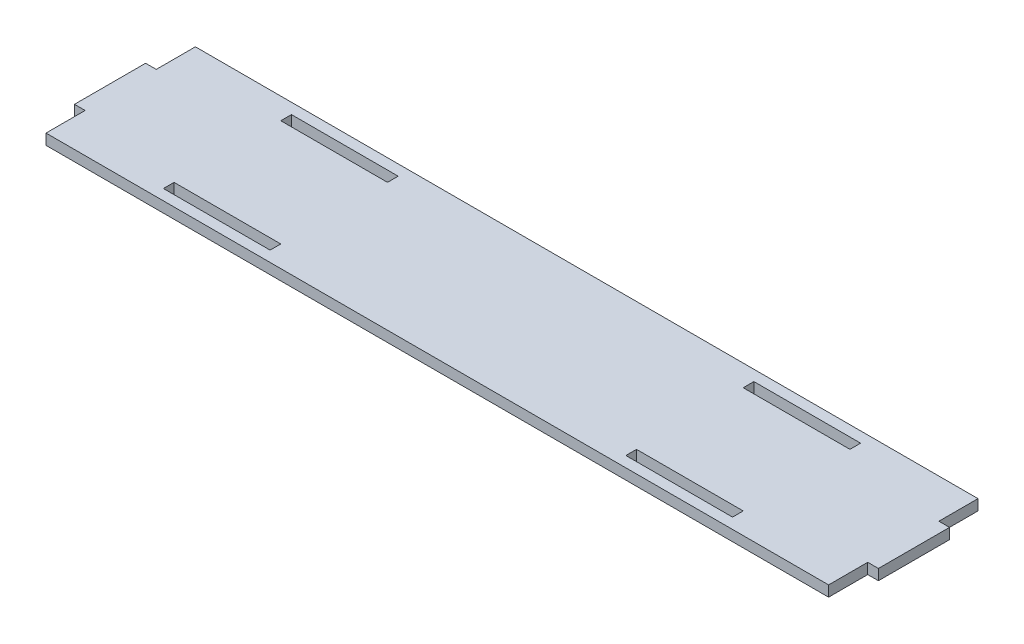
ISO-10303-21;
HEADER;
FILE_DESCRIPTION(('STEP AP214'),'2;1');
FILE_NAME('part.step','',(''),(''),'','','');
FILE_SCHEMA(('AUTOMOTIVE_DESIGN { 1 0 10303 214 1 1 1 1 }'));
ENDSEC;
DATA;
#1=APPLICATION_CONTEXT('core data for automotive mechanical design processes');
#2=APPLICATION_PROTOCOL_DEFINITION('international standard','automotive_design',2000,#1);
#3=PRODUCT_CONTEXT('',#1,'mechanical');
#4=PRODUCT('Part','Part','',(#3));
#5=PRODUCT_RELATED_PRODUCT_CATEGORY('part','',(#4));
#6=PRODUCT_DEFINITION_FORMATION('','',#4);
#7=PRODUCT_DEFINITION_CONTEXT('part definition',#1,'design');
#8=PRODUCT_DEFINITION('design','',#6,#7);
#9=PRODUCT_DEFINITION_SHAPE('','',#8);
#10=(LENGTH_UNIT() NAMED_UNIT(*) SI_UNIT(.MILLI.,.METRE.));
#11=(NAMED_UNIT(*) PLANE_ANGLE_UNIT() SI_UNIT($,.RADIAN.));
#12=(NAMED_UNIT(*) SI_UNIT($,.STERADIAN.) SOLID_ANGLE_UNIT());
#13=UNCERTAINTY_MEASURE_WITH_UNIT(LENGTH_MEASURE(1.E-05),#10,'distance_accuracy_value','');
#14=(GEOMETRIC_REPRESENTATION_CONTEXT(3) GLOBAL_UNCERTAINTY_ASSIGNED_CONTEXT((#13)) GLOBAL_UNIT_ASSIGNED_CONTEXT((#10,
#11,#12)) REPRESENTATION_CONTEXT('',''));
#15=CARTESIAN_POINT('',(0.,0.,0.));
#16=DIRECTION('',(0.,0.,1.));
#17=DIRECTION('',(1.,0.,0.));
#18=AXIS2_PLACEMENT_3D('',#15,#16,#17);
#19=CARTESIAN_POINT('',(0.,3.,0.));
#20=DIRECTION('',(0.,-1.,0.));
#21=DIRECTION('',(0.,0.,-1.));
#22=AXIS2_PLACEMENT_3D('',#19,#20,#21);
#23=PLANE('',#22);
#24=DIRECTION('',(1.,0.,0.));
#25=VECTOR('',#24,1.);
#26=CARTESIAN_POINT('',(30.,3.,-2.99999999999999));
#27=LINE('',#26,#25);
#28=CARTESIAN_POINT('',(30.,3.,-2.99999999999999));
#29=VERTEX_POINT('',#28);
#30=CARTESIAN_POINT('',(60.,3.,-2.99999999999999));
#31=VERTEX_POINT('',#30);
#32=EDGE_CURVE('E415',#29,#31,#27,.T.);
#33=ORIENTED_EDGE('',*,*,#32,.F.);
#34=DIRECTION('',(0.,0.,-1.));
#35=VECTOR('',#34,1.);
#36=CARTESIAN_POINT('',(30.,3.,-2.99999999999999));
#37=LINE('',#36,#35);
#38=CARTESIAN_POINT('',(30.,3.,-5.99999999999999));
#39=VERTEX_POINT('',#38);
#40=EDGE_CURVE('E412',#29,#39,#37,.T.);
#41=ORIENTED_EDGE('',*,*,#40,.T.);
#42=DIRECTION('',(1.,0.,0.));
#43=VECTOR('',#42,1.);
#44=CARTESIAN_POINT('',(30.,3.,-5.99999999999999));
#45=LINE('',#44,#43);
#46=CARTESIAN_POINT('',(60.,3.,-5.99999999999999));
#47=VERTEX_POINT('',#46);
#48=EDGE_CURVE('E418',#39,#47,#45,.T.);
#49=ORIENTED_EDGE('',*,*,#48,.T.);
#50=DIRECTION('',(0.,0.,-1.));
#51=VECTOR('',#50,1.);
#52=CARTESIAN_POINT('',(60.,3.,-2.99999999999999));
#53=LINE('',#52,#51);
#54=EDGE_CURVE('E422',#31,#47,#53,.T.);
#55=ORIENTED_EDGE('',*,*,#54,.F.);
#56=EDGE_LOOP('',(#33,#41,#49,#55));
#57=FACE_BOUND('',#56,.T.);
#58=DIRECTION('',(0.,0.,1.));
#59=VECTOR('',#58,1.);
#60=CARTESIAN_POINT('',(160.,3.,-39.));
#61=LINE('',#60,#59);
#62=CARTESIAN_POINT('',(160.,3.,-39.));
#63=VERTEX_POINT('',#62);
#64=CARTESIAN_POINT('',(160.,3.,-36.));
#65=VERTEX_POINT('',#64);
#66=EDGE_CURVE('E476',#63,#65,#61,.T.);
#67=ORIENTED_EDGE('',*,*,#66,.F.);
#68=DIRECTION('',(1.,0.,0.));
#69=VECTOR('',#68,1.);
#70=CARTESIAN_POINT('',(160.,3.,-39.));
#71=LINE('',#70,#69);
#72=CARTESIAN_POINT('',(190.,3.,-39.));
#73=VERTEX_POINT('',#72);
#74=EDGE_CURVE('E484',#63,#73,#71,.T.);
#75=ORIENTED_EDGE('',*,*,#74,.T.);
#76=DIRECTION('',(0.,0.,1.));
#77=VECTOR('',#76,1.);
#78=CARTESIAN_POINT('',(190.,3.,-39.));
#79=LINE('',#78,#77);
#80=CARTESIAN_POINT('',(190.,3.,-36.));
#81=VERTEX_POINT('',#80);
#82=EDGE_CURVE('E481',#73,#81,#79,.T.);
#83=ORIENTED_EDGE('',*,*,#82,.T.);
#84=DIRECTION('',(1.,0.,0.));
#85=VECTOR('',#84,1.);
#86=CARTESIAN_POINT('',(160.,3.,-36.));
#87=LINE('',#86,#85);
#88=EDGE_CURVE('E478',#65,#81,#87,.T.);
#89=ORIENTED_EDGE('',*,*,#88,.F.);
#90=EDGE_LOOP('',(#67,#75,#83,#89));
#91=FACE_BOUND('',#90,.T.);
#92=DIRECTION('',(1.,0.,0.));
#93=VECTOR('',#92,1.);
#94=CARTESIAN_POINT('',(160.,3.,-2.99999999999999));
#95=LINE('',#94,#93);
#96=CARTESIAN_POINT('',(160.,3.,-2.99999999999999));
#97=VERTEX_POINT('',#96);
#98=CARTESIAN_POINT('',(190.,3.,-2.99999999999999));
#99=VERTEX_POINT('',#98);
#100=EDGE_CURVE('E518',#97,#99,#95,.T.);
#101=ORIENTED_EDGE('',*,*,#100,.F.);
#102=DIRECTION('',(0.,0.,-1.));
#103=VECTOR('',#102,1.);
#104=CARTESIAN_POINT('',(160.,3.,-2.99999999999999));
#105=LINE('',#104,#103);
#106=CARTESIAN_POINT('',(160.,3.,-5.99999999999998));
#107=VERTEX_POINT('',#106);
#108=EDGE_CURVE('E508',#97,#107,#105,.T.);
#109=ORIENTED_EDGE('',*,*,#108,.T.);
#110=DIRECTION('',(1.,0.,0.));
#111=VECTOR('',#110,1.);
#112=CARTESIAN_POINT('',(160.,3.,-5.99999999999998));
#113=LINE('',#112,#111);
#114=CARTESIAN_POINT('',(190.,3.,-5.99999999999999));
#115=VERTEX_POINT('',#114);
#116=EDGE_CURVE('E511',#107,#115,#113,.T.);
#117=ORIENTED_EDGE('',*,*,#116,.T.);
#118=DIRECTION('',(0.,0.,-1.));
#119=VECTOR('',#118,1.);
#120=CARTESIAN_POINT('',(190.,3.,-2.99999999999999));
#121=LINE('',#120,#119);
#122=EDGE_CURVE('E515',#99,#115,#121,.T.);
#123=ORIENTED_EDGE('',*,*,#122,.F.);
#124=EDGE_LOOP('',(#101,#109,#117,#123));
#125=FACE_BOUND('',#124,.T.);
#126=DIRECTION('',(0.,0.,-1.));
#127=VECTOR('',#126,1.);
#128=CARTESIAN_POINT('',(0.,3.,-31.));
#129=LINE('',#128,#127);
#130=CARTESIAN_POINT('',(0.,3.,-31.));
#131=VERTEX_POINT('',#130);
#132=CARTESIAN_POINT('',(0.,3.,-42.));
#133=VERTEX_POINT('',#132);
#134=EDGE_CURVE('E539',#131,#133,#129,.T.);
#135=ORIENTED_EDGE('',*,*,#134,.F.);
#136=DIRECTION('',(-1.,0.,0.));
#137=VECTOR('',#136,1.);
#138=CARTESIAN_POINT('',(0.,3.,-31.));
#139=LINE('',#138,#137);
#140=CARTESIAN_POINT('',(-3.,3.,-31.));
#141=VERTEX_POINT('',#140);
#142=EDGE_CURVE('E568',#131,#141,#139,.T.);
#143=ORIENTED_EDGE('',*,*,#142,.T.);
#144=DIRECTION('',(0.,0.,1.));
#145=VECTOR('',#144,1.);
#146=CARTESIAN_POINT('',(-3.,3.,-31.));
#147=LINE('',#146,#145);
#148=CARTESIAN_POINT('',(-3.,3.,-11.));
#149=VERTEX_POINT('',#148);
#150=EDGE_CURVE('E566',#141,#149,#147,.T.);
#151=ORIENTED_EDGE('',*,*,#150,.T.);
#152=DIRECTION('',(-1.,0.,0.));
#153=VECTOR('',#152,1.);
#154=CARTESIAN_POINT('',(0.,3.,-11.));
#155=LINE('',#154,#153);
#156=CARTESIAN_POINT('',(0.,3.,-11.));
#157=VERTEX_POINT('',#156);
#158=EDGE_CURVE('E563',#157,#149,#155,.T.);
#159=ORIENTED_EDGE('',*,*,#158,.F.);
#160=DIRECTION('',(0.,0.,-1.));
#161=VECTOR('',#160,1.);
#162=CARTESIAN_POINT('',(0.,3.,0.));
#163=LINE('',#162,#161);
#164=CARTESIAN_POINT('',(0.,3.,0.));
#165=VERTEX_POINT('',#164);
#166=EDGE_CURVE('E560',#165,#157,#163,.T.);
#167=ORIENTED_EDGE('',*,*,#166,.F.);
#168=DIRECTION('',(1.,0.,0.));
#169=VECTOR('',#168,1.);
#170=CARTESIAN_POINT('',(0.,3.,0.));
#171=LINE('',#170,#169);
#172=CARTESIAN_POINT('',(220.,3.,0.));
#173=VERTEX_POINT('',#172);
#174=EDGE_CURVE('E558',#165,#173,#171,.T.);
#175=ORIENTED_EDGE('',*,*,#174,.T.);
#176=DIRECTION('',(0.,0.,-1.));
#177=VECTOR('',#176,1.);
#178=CARTESIAN_POINT('',(220.,3.,0.));
#179=LINE('',#178,#177);
#180=CARTESIAN_POINT('',(220.,3.,-11.));
#181=VERTEX_POINT('',#180);
#182=EDGE_CURVE('E556',#173,#181,#179,.T.);
#183=ORIENTED_EDGE('',*,*,#182,.T.);
#184=DIRECTION('',(1.,0.,0.));
#185=VECTOR('',#184,1.);
#186=CARTESIAN_POINT('',(220.,3.,-11.));
#187=LINE('',#186,#185);
#188=CARTESIAN_POINT('',(223.,3.,-11.));
#189=VERTEX_POINT('',#188);
#190=EDGE_CURVE('E554',#181,#189,#187,.T.);
#191=ORIENTED_EDGE('',*,*,#190,.T.);
#192=DIRECTION('',(0.,0.,1.));
#193=VECTOR('',#192,1.);
#194=CARTESIAN_POINT('',(223.,3.,-31.));
#195=LINE('',#194,#193);
#196=CARTESIAN_POINT('',(223.,3.,-31.));
#197=VERTEX_POINT('',#196);
#198=EDGE_CURVE('E551',#197,#189,#195,.T.);
#199=ORIENTED_EDGE('',*,*,#198,.F.);
#200=DIRECTION('',(1.,0.,0.));
#201=VECTOR('',#200,1.);
#202=CARTESIAN_POINT('',(220.,3.,-31.));
#203=LINE('',#202,#201);
#204=CARTESIAN_POINT('',(220.,3.,-31.));
#205=VERTEX_POINT('',#204);
#206=EDGE_CURVE('E548',#205,#197,#203,.T.);
#207=ORIENTED_EDGE('',*,*,#206,.F.);
#208=DIRECTION('',(0.,0.,-1.));
#209=VECTOR('',#208,1.);
#210=CARTESIAN_POINT('',(220.,3.,-31.));
#211=LINE('',#210,#209);
#212=CARTESIAN_POINT('',(220.,3.,-42.));
#213=VERTEX_POINT('',#212);
#214=EDGE_CURVE('E546',#205,#213,#211,.T.);
#215=ORIENTED_EDGE('',*,*,#214,.T.);
#216=DIRECTION('',(1.,0.,0.));
#217=VECTOR('',#216,1.);
#218=CARTESIAN_POINT('',(0.,3.,-42.));
#219=LINE('',#218,#217);
#220=EDGE_CURVE('E542',#133,#213,#219,.T.);
#221=ORIENTED_EDGE('',*,*,#220,.F.);
#222=EDGE_LOOP('',(#135,#143,#151,#159,#167,#175,#183,#191,#199,#207,#215,#221));
#223=FACE_BOUND('',#222,.T.);
#224=DIRECTION('',(0.,0.,1.));
#225=VECTOR('',#224,1.);
#226=CARTESIAN_POINT('',(30.,3.,-39.));
#227=LINE('',#226,#225);
#228=CARTESIAN_POINT('',(30.,3.,-39.));
#229=VERTEX_POINT('',#228);
#230=CARTESIAN_POINT('',(30.,3.,-36.));
#231=VERTEX_POINT('',#230);
#232=EDGE_CURVE('E444',#229,#231,#227,.T.);
#233=ORIENTED_EDGE('',*,*,#232,.F.);
#234=DIRECTION('',(1.,0.,0.));
#235=VECTOR('',#234,1.);
#236=CARTESIAN_POINT('',(30.,3.,-39.));
#237=LINE('',#236,#235);
#238=CARTESIAN_POINT('',(60.,3.,-39.));
#239=VERTEX_POINT('',#238);
#240=EDGE_CURVE('E452',#229,#239,#237,.T.);
#241=ORIENTED_EDGE('',*,*,#240,.T.);
#242=DIRECTION('',(0.,0.,1.));
#243=VECTOR('',#242,1.);
#244=CARTESIAN_POINT('',(60.,3.,-39.));
#245=LINE('',#244,#243);
#246=CARTESIAN_POINT('',(60.,3.,-36.));
#247=VERTEX_POINT('',#246);
#248=EDGE_CURVE('E449',#239,#247,#245,.T.);
#249=ORIENTED_EDGE('',*,*,#248,.T.);
#250=DIRECTION('',(1.,0.,0.));
#251=VECTOR('',#250,1.);
#252=CARTESIAN_POINT('',(30.,3.,-36.));
#253=LINE('',#252,#251);
#254=EDGE_CURVE('E446',#231,#247,#253,.T.);
#255=ORIENTED_EDGE('',*,*,#254,.F.);
#256=EDGE_LOOP('',(#233,#241,#249,#255));
#257=FACE_BOUND('',#256,.T.);
#258=ADVANCED_FACE('F224',(#57,#91,#125,#223,#257),#23,.F.);
#259=CARTESIAN_POINT('',(0.,0.,0.));
#260=DIRECTION('',(0.,-1.,0.));
#261=DIRECTION('',(0.,0.,-1.));
#262=AXIS2_PLACEMENT_3D('',#259,#260,#261);
#263=PLANE('',#262);
#264=DIRECTION('',(0.,0.,-1.));
#265=VECTOR('',#264,1.);
#266=CARTESIAN_POINT('',(30.,0.,-2.99999999999999));
#267=LINE('',#266,#265);
#268=CARTESIAN_POINT('',(30.,0.,-2.99999999999999));
#269=VERTEX_POINT('',#268);
#270=CARTESIAN_POINT('',(30.,0.,-5.99999999999999));
#271=VERTEX_POINT('',#270);
#272=EDGE_CURVE('E249',#269,#271,#267,.T.);
#273=ORIENTED_EDGE('',*,*,#272,.F.);
#274=DIRECTION('',(1.,0.,0.));
#275=VECTOR('',#274,1.);
#276=CARTESIAN_POINT('',(30.,0.,-2.99999999999999));
#277=LINE('',#276,#275);
#278=CARTESIAN_POINT('',(60.,0.,-2.99999999999999));
#279=VERTEX_POINT('',#278);
#280=EDGE_CURVE('E425',#269,#279,#277,.T.);
#281=ORIENTED_EDGE('',*,*,#280,.T.);
#282=DIRECTION('',(0.,0.,-1.));
#283=VECTOR('',#282,1.);
#284=CARTESIAN_POINT('',(60.,0.,-2.99999999999999));
#285=LINE('',#284,#283);
#286=CARTESIAN_POINT('',(60.,0.,-5.99999999999999));
#287=VERTEX_POINT('',#286);
#288=EDGE_CURVE('E428',#279,#287,#285,.T.);
#289=ORIENTED_EDGE('',*,*,#288,.T.);
#290=DIRECTION('',(1.,0.,0.));
#291=VECTOR('',#290,1.);
#292=CARTESIAN_POINT('',(30.,0.,-5.99999999999999));
#293=LINE('',#292,#291);
#294=EDGE_CURVE('E434',#271,#287,#293,.T.);
#295=ORIENTED_EDGE('',*,*,#294,.F.);
#296=EDGE_LOOP('',(#273,#281,#289,#295));
#297=FACE_BOUND('',#296,.T.);
#298=DIRECTION('',(0.,0.,-1.));
#299=VECTOR('',#298,1.);
#300=CARTESIAN_POINT('',(160.,0.,-2.99999999999999));
#301=LINE('',#300,#299);
#302=CARTESIAN_POINT('',(160.,0.,-2.99999999999999));
#303=VERTEX_POINT('',#302);
#304=CARTESIAN_POINT('',(160.,0.,-5.99999999999998));
#305=VERTEX_POINT('',#304);
#306=EDGE_CURVE('E507',#303,#305,#301,.T.);
#307=ORIENTED_EDGE('',*,*,#306,.F.);
#308=DIRECTION('',(1.,0.,0.));
#309=VECTOR('',#308,1.);
#310=CARTESIAN_POINT('',(160.,0.,-2.99999999999999));
#311=LINE('',#310,#309);
#312=CARTESIAN_POINT('',(190.,0.,-2.99999999999999));
#313=VERTEX_POINT('',#312);
#314=EDGE_CURVE('E512',#303,#313,#311,.T.);
#315=ORIENTED_EDGE('',*,*,#314,.T.);
#316=DIRECTION('',(0.,0.,-1.));
#317=VECTOR('',#316,1.);
#318=CARTESIAN_POINT('',(190.,0.,-2.99999999999999));
#319=LINE('',#318,#317);
#320=CARTESIAN_POINT('',(190.,0.,-5.99999999999999));
#321=VERTEX_POINT('',#320);
#322=EDGE_CURVE('E525',#313,#321,#319,.T.);
#323=ORIENTED_EDGE('',*,*,#322,.T.);
#324=DIRECTION('',(1.,0.,0.));
#325=VECTOR('',#324,1.);
#326=CARTESIAN_POINT('',(160.,0.,-5.99999999999998));
#327=LINE('',#326,#325);
#328=EDGE_CURVE('E522',#305,#321,#327,.T.);
#329=ORIENTED_EDGE('',*,*,#328,.F.);
#330=EDGE_LOOP('',(#307,#315,#323,#329));
#331=FACE_BOUND('',#330,.T.);
#332=DIRECTION('',(0.,0.,-1.));
#333=VECTOR('',#332,1.);
#334=CARTESIAN_POINT('',(0.,0.,-31.));
#335=LINE('',#334,#333);
#336=CARTESIAN_POINT('',(0.,0.,-31.));
#337=VERTEX_POINT('',#336);
#338=CARTESIAN_POINT('',(0.,0.,-42.));
#339=VERTEX_POINT('',#338);
#340=EDGE_CURVE('E532',#337,#339,#335,.T.);
#341=ORIENTED_EDGE('',*,*,#340,.T.);
#342=DIRECTION('',(1.,0.,0.));
#343=VECTOR('',#342,1.);
#344=CARTESIAN_POINT('',(0.,0.,-42.));
#345=LINE('',#344,#343);
#346=CARTESIAN_POINT('',(220.,0.,-42.));
#347=VERTEX_POINT('',#346);
#348=EDGE_CURVE('E572',#339,#347,#345,.T.);
#349=ORIENTED_EDGE('',*,*,#348,.T.);
#350=DIRECTION('',(0.,0.,-1.));
#351=VECTOR('',#350,1.);
#352=CARTESIAN_POINT('',(220.,0.,-31.));
#353=LINE('',#352,#351);
#354=CARTESIAN_POINT('',(220.,0.,-31.));
#355=VERTEX_POINT('',#354);
#356=EDGE_CURVE('E575',#355,#347,#353,.T.);
#357=ORIENTED_EDGE('',*,*,#356,.F.);
#358=DIRECTION('',(1.,0.,0.));
#359=VECTOR('',#358,1.);
#360=CARTESIAN_POINT('',(220.,0.,-31.));
#361=LINE('',#360,#359);
#362=CARTESIAN_POINT('',(223.,0.,-31.));
#363=VERTEX_POINT('',#362);
#364=EDGE_CURVE('E578',#355,#363,#361,.T.);
#365=ORIENTED_EDGE('',*,*,#364,.T.);
#366=DIRECTION('',(0.,0.,1.));
#367=VECTOR('',#366,1.);
#368=CARTESIAN_POINT('',(223.,0.,-31.));
#369=LINE('',#368,#367);
#370=CARTESIAN_POINT('',(223.,0.,-11.));
#371=VERTEX_POINT('',#370);
#372=EDGE_CURVE('E581',#363,#371,#369,.T.);
#373=ORIENTED_EDGE('',*,*,#372,.T.);
#374=DIRECTION('',(1.,0.,0.));
#375=VECTOR('',#374,1.);
#376=CARTESIAN_POINT('',(220.,0.,-11.));
#377=LINE('',#376,#375);
#378=CARTESIAN_POINT('',(220.,0.,-11.));
#379=VERTEX_POINT('',#378);
#380=EDGE_CURVE('E584',#379,#371,#377,.T.);
#381=ORIENTED_EDGE('',*,*,#380,.F.);
#382=DIRECTION('',(0.,0.,-1.));
#383=VECTOR('',#382,1.);
#384=CARTESIAN_POINT('',(220.,0.,0.));
#385=LINE('',#384,#383);
#386=CARTESIAN_POINT('',(220.,0.,0.));
#387=VERTEX_POINT('',#386);
#388=EDGE_CURVE('E587',#387,#379,#385,.T.);
#389=ORIENTED_EDGE('',*,*,#388,.F.);
#390=DIRECTION('',(1.,0.,0.));
#391=VECTOR('',#390,1.);
#392=CARTESIAN_POINT('',(0.,0.,0.));
#393=LINE('',#392,#391);
#394=CARTESIAN_POINT('',(0.,0.,0.));
#395=VERTEX_POINT('',#394);
#396=EDGE_CURVE('E589',#395,#387,#393,.T.);
#397=ORIENTED_EDGE('',*,*,#396,.F.);
#398=DIRECTION('',(0.,0.,-1.));
#399=VECTOR('',#398,1.);
#400=CARTESIAN_POINT('',(0.,0.,0.));
#401=LINE('',#400,#399);
#402=CARTESIAN_POINT('',(0.,0.,-11.));
#403=VERTEX_POINT('',#402);
#404=EDGE_CURVE('E591',#395,#403,#401,.T.);
#405=ORIENTED_EDGE('',*,*,#404,.T.);
#406=DIRECTION('',(-1.,0.,0.));
#407=VECTOR('',#406,1.);
#408=CARTESIAN_POINT('',(0.,0.,-11.));
#409=LINE('',#408,#407);
#410=CARTESIAN_POINT('',(-3.,0.,-11.));
#411=VERTEX_POINT('',#410);
#412=EDGE_CURVE('E594',#403,#411,#409,.T.);
#413=ORIENTED_EDGE('',*,*,#412,.T.);
#414=DIRECTION('',(0.,0.,1.));
#415=VECTOR('',#414,1.);
#416=CARTESIAN_POINT('',(-3.,0.,-31.));
#417=LINE('',#416,#415);
#418=CARTESIAN_POINT('',(-3.,0.,-31.));
#419=VERTEX_POINT('',#418);
#420=EDGE_CURVE('E597',#419,#411,#417,.T.);
#421=ORIENTED_EDGE('',*,*,#420,.F.);
#422=DIRECTION('',(-1.,0.,0.));
#423=VECTOR('',#422,1.);
#424=CARTESIAN_POINT('',(0.,0.,-31.));
#425=LINE('',#424,#423);
#426=EDGE_CURVE('E543',#337,#419,#425,.T.);
#427=ORIENTED_EDGE('',*,*,#426,.F.);
#428=EDGE_LOOP('',(#341,#349,#357,#365,#373,#381,#389,#397,#405,#413,#421,#427));
#429=FACE_BOUND('',#428,.T.);
#430=DIRECTION('',(1.,0.,0.));
#431=VECTOR('',#430,1.);
#432=CARTESIAN_POINT('',(160.,0.,-39.));
#433=LINE('',#432,#431);
#434=CARTESIAN_POINT('',(160.,0.,-39.));
#435=VERTEX_POINT('',#434);
#436=CARTESIAN_POINT('',(190.,0.,-39.));
#437=VERTEX_POINT('',#436);
#438=EDGE_CURVE('E479',#435,#437,#433,.T.);
#439=ORIENTED_EDGE('',*,*,#438,.F.);
#440=DIRECTION('',(0.,0.,1.));
#441=VECTOR('',#440,1.);
#442=CARTESIAN_POINT('',(160.,0.,-39.));
#443=LINE('',#442,#441);
#444=CARTESIAN_POINT('',(160.,0.,-36.));
#445=VERTEX_POINT('',#444);
#446=EDGE_CURVE('E475',#435,#445,#443,.T.);
#447=ORIENTED_EDGE('',*,*,#446,.T.);
#448=DIRECTION('',(1.,0.,0.));
#449=VECTOR('',#448,1.);
#450=CARTESIAN_POINT('',(160.,0.,-36.));
#451=LINE('',#450,#449);
#452=CARTESIAN_POINT('',(190.,0.,-36.));
#453=VERTEX_POINT('',#452);
#454=EDGE_CURVE('E490',#445,#453,#451,.T.);
#455=ORIENTED_EDGE('',*,*,#454,.T.);
#456=DIRECTION('',(0.,0.,1.));
#457=VECTOR('',#456,1.);
#458=CARTESIAN_POINT('',(190.,0.,-39.));
#459=LINE('',#458,#457);
#460=EDGE_CURVE('E493',#437,#453,#459,.T.);
#461=ORIENTED_EDGE('',*,*,#460,.F.);
#462=EDGE_LOOP('',(#439,#447,#455,#461));
#463=FACE_BOUND('',#462,.T.);
#464=DIRECTION('',(1.,0.,0.));
#465=VECTOR('',#464,1.);
#466=CARTESIAN_POINT('',(30.,0.,-39.));
#467=LINE('',#466,#465);
#468=CARTESIAN_POINT('',(30.,0.,-39.));
#469=VERTEX_POINT('',#468);
#470=CARTESIAN_POINT('',(60.,0.,-39.));
#471=VERTEX_POINT('',#470);
#472=EDGE_CURVE('E447',#469,#471,#467,.T.);
#473=ORIENTED_EDGE('',*,*,#472,.F.);
#474=DIRECTION('',(0.,0.,1.));
#475=VECTOR('',#474,1.);
#476=CARTESIAN_POINT('',(30.,0.,-39.));
#477=LINE('',#476,#475);
#478=CARTESIAN_POINT('',(30.,0.,-36.));
#479=VERTEX_POINT('',#478);
#480=EDGE_CURVE('E440',#469,#479,#477,.T.);
#481=ORIENTED_EDGE('',*,*,#480,.T.);
#482=DIRECTION('',(1.,0.,0.));
#483=VECTOR('',#482,1.);
#484=CARTESIAN_POINT('',(30.,0.,-36.));
#485=LINE('',#484,#483);
#486=CARTESIAN_POINT('',(60.,0.,-36.));
#487=VERTEX_POINT('',#486);
#488=EDGE_CURVE('E458',#479,#487,#485,.T.);
#489=ORIENTED_EDGE('',*,*,#488,.T.);
#490=DIRECTION('',(0.,0.,1.));
#491=VECTOR('',#490,1.);
#492=CARTESIAN_POINT('',(60.,0.,-39.));
#493=LINE('',#492,#491);
#494=EDGE_CURVE('E461',#471,#487,#493,.T.);
#495=ORIENTED_EDGE('',*,*,#494,.F.);
#496=EDGE_LOOP('',(#473,#481,#489,#495));
#497=FACE_BOUND('',#496,.T.);
#498=ADVANCED_FACE('F632',(#297,#331,#429,#463,#497),#263,.T.);
#499=CARTESIAN_POINT('',(0.,3.,-31.));
#500=DIRECTION('',(-1.,0.,0.));
#501=DIRECTION('',(0.,0.,1.));
#502=AXIS2_PLACEMENT_3D('',#499,#500,#501);
#503=PLANE('',#502);
#504=ORIENTED_EDGE('',*,*,#340,.F.);
#505=DIRECTION('',(0.,-1.,0.));
#506=VECTOR('',#505,1.);
#507=CARTESIAN_POINT('',(0.,3.,-31.));
#508=LINE('',#507,#506);
#509=EDGE_CURVE('E12',#131,#337,#508,.T.);
#510=ORIENTED_EDGE('',*,*,#509,.F.);
#511=ORIENTED_EDGE('',*,*,#134,.T.);
#512=DIRECTION('',(0.,-1.,0.));
#513=VECTOR('',#512,1.);
#514=CARTESIAN_POINT('',(0.,3.,-42.));
#515=LINE('',#514,#513);
#516=EDGE_CURVE('E228',#133,#339,#515,.T.);
#517=ORIENTED_EDGE('',*,*,#516,.T.);
#518=EDGE_LOOP('',(#504,#510,#511,#517));
#519=FACE_BOUND('',#518,.T.);
#520=ADVANCED_FACE('F226',(#519),#503,.T.);
#521=CARTESIAN_POINT('',(0.,3.,-31.));
#522=DIRECTION('',(0.,0.,1.));
#523=DIRECTION('',(1.,0.,0.));
#524=AXIS2_PLACEMENT_3D('',#521,#522,#523);
#525=PLANE('',#524);
#526=ORIENTED_EDGE('',*,*,#426,.T.);
#527=DIRECTION('',(0.,-1.,0.));
#528=VECTOR('',#527,1.);
#529=CARTESIAN_POINT('',(-3.,3.,-31.));
#530=LINE('',#529,#528);
#531=EDGE_CURVE('E233',#141,#419,#530,.T.);
#532=ORIENTED_EDGE('',*,*,#531,.F.);
#533=ORIENTED_EDGE('',*,*,#142,.F.);
#534=ORIENTED_EDGE('',*,*,#509,.T.);
#535=EDGE_LOOP('',(#526,#532,#533,#534));
#536=FACE_BOUND('',#535,.T.);
#537=ADVANCED_FACE('F637',(#536),#525,.F.);
#538=CARTESIAN_POINT('',(-3.,3.,-31.));
#539=DIRECTION('',(1.,0.,0.));
#540=DIRECTION('',(0.,0.,-1.));
#541=AXIS2_PLACEMENT_3D('',#538,#539,#540);
#542=PLANE('',#541);
#543=ORIENTED_EDGE('',*,*,#420,.T.);
#544=DIRECTION('',(0.,-1.,0.));
#545=VECTOR('',#544,1.);
#546=CARTESIAN_POINT('',(-3.,3.,-11.));
#547=LINE('',#546,#545);
#548=EDGE_CURVE('E603',#149,#411,#547,.T.);
#549=ORIENTED_EDGE('',*,*,#548,.F.);
#550=ORIENTED_EDGE('',*,*,#150,.F.);
#551=ORIENTED_EDGE('',*,*,#531,.T.);
#552=EDGE_LOOP('',(#543,#549,#550,#551));
#553=FACE_BOUND('',#552,.T.);
#554=ADVANCED_FACE('F641',(#553),#542,.F.);
#555=CARTESIAN_POINT('',(0.,3.,-11.));
#556=DIRECTION('',(0.,0.,1.));
#557=DIRECTION('',(1.,0.,0.));
#558=AXIS2_PLACEMENT_3D('',#555,#556,#557);
#559=PLANE('',#558);
#560=ORIENTED_EDGE('',*,*,#412,.F.);
#561=DIRECTION('',(0.,-1.,0.));
#562=VECTOR('',#561,1.);
#563=CARTESIAN_POINT('',(0.,3.,-11.));
#564=LINE('',#563,#562);
#565=EDGE_CURVE('E605',#157,#403,#564,.T.);
#566=ORIENTED_EDGE('',*,*,#565,.F.);
#567=ORIENTED_EDGE('',*,*,#158,.T.);
#568=ORIENTED_EDGE('',*,*,#548,.T.);
#569=EDGE_LOOP('',(#560,#566,#567,#568));
#570=FACE_BOUND('',#569,.T.);
#571=ADVANCED_FACE('F678',(#570),#559,.T.);
#572=CARTESIAN_POINT('',(0.,3.,0.));
#573=DIRECTION('',(-1.,0.,0.));
#574=DIRECTION('',(0.,0.,1.));
#575=AXIS2_PLACEMENT_3D('',#572,#573,#574);
#576=PLANE('',#575);
#577=ORIENTED_EDGE('',*,*,#404,.F.);
#578=DIRECTION('',(0.,-1.,0.));
#579=VECTOR('',#578,1.);
#580=CARTESIAN_POINT('',(0.,3.,0.));
#581=LINE('',#580,#579);
#582=EDGE_CURVE('E607',#165,#395,#581,.T.);
#583=ORIENTED_EDGE('',*,*,#582,.F.);
#584=ORIENTED_EDGE('',*,*,#166,.T.);
#585=ORIENTED_EDGE('',*,*,#565,.T.);
#586=EDGE_LOOP('',(#577,#583,#584,#585));
#587=FACE_BOUND('',#586,.T.);
#588=ADVANCED_FACE('F675',(#587),#576,.T.);
#589=CARTESIAN_POINT('',(0.,3.,0.));
#590=DIRECTION('',(0.,0.,-1.));
#591=DIRECTION('',(-1.,0.,0.));
#592=AXIS2_PLACEMENT_3D('',#589,#590,#591);
#593=PLANE('',#592);
#594=ORIENTED_EDGE('',*,*,#396,.T.);
#595=DIRECTION('',(0.,-1.,0.));
#596=VECTOR('',#595,1.);
#597=CARTESIAN_POINT('',(220.,3.,0.));
#598=LINE('',#597,#596);
#599=EDGE_CURVE('E609',#173,#387,#598,.T.);
#600=ORIENTED_EDGE('',*,*,#599,.F.);
#601=ORIENTED_EDGE('',*,*,#174,.F.);
#602=ORIENTED_EDGE('',*,*,#582,.T.);
#603=EDGE_LOOP('',(#594,#600,#601,#602));
#604=FACE_BOUND('',#603,.T.);
#605=ADVANCED_FACE('F672',(#604),#593,.F.);
#606=CARTESIAN_POINT('',(220.,3.,0.));
#607=DIRECTION('',(-1.,0.,0.));
#608=DIRECTION('',(0.,0.,1.));
#609=AXIS2_PLACEMENT_3D('',#606,#607,#608);
#610=PLANE('',#609);
#611=ORIENTED_EDGE('',*,*,#388,.T.);
#612=DIRECTION('',(0.,-1.,0.));
#613=VECTOR('',#612,1.);
#614=CARTESIAN_POINT('',(220.,3.,-11.));
#615=LINE('',#614,#613);
#616=EDGE_CURVE('E612',#181,#379,#615,.T.);
#617=ORIENTED_EDGE('',*,*,#616,.F.);
#618=ORIENTED_EDGE('',*,*,#182,.F.);
#619=ORIENTED_EDGE('',*,*,#599,.T.);
#620=EDGE_LOOP('',(#611,#617,#618,#619));
#621=FACE_BOUND('',#620,.T.);
#622=ADVANCED_FACE('F668',(#621),#610,.F.);
#623=CARTESIAN_POINT('',(220.,3.,-11.));
#624=DIRECTION('',(0.,0.,-1.));
#625=DIRECTION('',(-1.,0.,0.));
#626=AXIS2_PLACEMENT_3D('',#623,#624,#625);
#627=PLANE('',#626);
#628=ORIENTED_EDGE('',*,*,#380,.T.);
#629=DIRECTION('',(0.,-1.,0.));
#630=VECTOR('',#629,1.);
#631=CARTESIAN_POINT('',(223.,3.,-11.));
#632=LINE('',#631,#630);
#633=EDGE_CURVE('E615',#189,#371,#632,.T.);
#634=ORIENTED_EDGE('',*,*,#633,.F.);
#635=ORIENTED_EDGE('',*,*,#190,.F.);
#636=ORIENTED_EDGE('',*,*,#616,.T.);
#637=EDGE_LOOP('',(#628,#634,#635,#636));
#638=FACE_BOUND('',#637,.T.);
#639=ADVANCED_FACE('F663',(#638),#627,.F.);
#640=CARTESIAN_POINT('',(223.,3.,-31.));
#641=DIRECTION('',(1.,0.,0.));
#642=DIRECTION('',(0.,0.,-1.));
#643=AXIS2_PLACEMENT_3D('',#640,#641,#642);
#644=PLANE('',#643);
#645=ORIENTED_EDGE('',*,*,#372,.F.);
#646=DIRECTION('',(0.,-1.,0.));
#647=VECTOR('',#646,1.);
#648=CARTESIAN_POINT('',(223.,3.,-31.));
#649=LINE('',#648,#647);
#650=EDGE_CURVE('E617',#197,#363,#649,.T.);
#651=ORIENTED_EDGE('',*,*,#650,.F.);
#652=ORIENTED_EDGE('',*,*,#198,.T.);
#653=ORIENTED_EDGE('',*,*,#633,.T.);
#654=EDGE_LOOP('',(#645,#651,#652,#653));
#655=FACE_BOUND('',#654,.T.);
#656=ADVANCED_FACE('F657',(#655),#644,.T.);
#657=CARTESIAN_POINT('',(220.,3.,-31.));
#658=DIRECTION('',(0.,0.,-1.));
#659=DIRECTION('',(-1.,0.,0.));
#660=AXIS2_PLACEMENT_3D('',#657,#658,#659);
#661=PLANE('',#660);
#662=ORIENTED_EDGE('',*,*,#364,.F.);
#663=DIRECTION('',(0.,-1.,0.));
#664=VECTOR('',#663,1.);
#665=CARTESIAN_POINT('',(220.,3.,-31.));
#666=LINE('',#665,#664);
#667=EDGE_CURVE('E619',#205,#355,#666,.T.);
#668=ORIENTED_EDGE('',*,*,#667,.F.);
#669=ORIENTED_EDGE('',*,*,#206,.T.);
#670=ORIENTED_EDGE('',*,*,#650,.T.);
#671=EDGE_LOOP('',(#662,#668,#669,#670));
#672=FACE_BOUND('',#671,.T.);
#673=ADVANCED_FACE('F654',(#672),#661,.T.);
#674=CARTESIAN_POINT('',(220.,3.,-31.));
#675=DIRECTION('',(-1.,0.,0.));
#676=DIRECTION('',(0.,0.,1.));
#677=AXIS2_PLACEMENT_3D('',#674,#675,#676);
#678=PLANE('',#677);
#679=ORIENTED_EDGE('',*,*,#356,.T.);
#680=DIRECTION('',(0.,-1.,0.));
#681=VECTOR('',#680,1.);
#682=CARTESIAN_POINT('',(220.,3.,-42.));
#683=LINE('',#682,#681);
#684=EDGE_CURVE('E620',#213,#347,#683,.T.);
#685=ORIENTED_EDGE('',*,*,#684,.F.);
#686=ORIENTED_EDGE('',*,*,#214,.F.);
#687=ORIENTED_EDGE('',*,*,#667,.T.);
#688=EDGE_LOOP('',(#679,#685,#686,#687));
#689=FACE_BOUND('',#688,.T.);
#690=ADVANCED_FACE('F651',(#689),#678,.F.);
#691=CARTESIAN_POINT('',(0.,3.,-42.));
#692=DIRECTION('',(0.,0.,-1.));
#693=DIRECTION('',(-1.,0.,0.));
#694=AXIS2_PLACEMENT_3D('',#691,#692,#693);
#695=PLANE('',#694);
#696=ORIENTED_EDGE('',*,*,#348,.F.);
#697=ORIENTED_EDGE('',*,*,#516,.F.);
#698=ORIENTED_EDGE('',*,*,#220,.T.);
#699=ORIENTED_EDGE('',*,*,#684,.T.);
#700=EDGE_LOOP('',(#696,#697,#698,#699));
#701=FACE_BOUND('',#700,.T.);
#702=ADVANCED_FACE('F628',(#701),#695,.T.);
#703=CARTESIAN_POINT('',(160.,3.,-2.99999999999999));
#704=DIRECTION('',(-1.,0.,0.));
#705=DIRECTION('',(0.,0.,1.));
#706=AXIS2_PLACEMENT_3D('',#703,#704,#705);
#707=PLANE('',#706);
#708=ORIENTED_EDGE('',*,*,#306,.T.);
#709=DIRECTION('',(0.,-1.,0.));
#710=VECTOR('',#709,1.);
#711=CARTESIAN_POINT('',(160.,3.,-5.99999999999998));
#712=LINE('',#711,#710);
#713=EDGE_CURVE('E520',#107,#305,#712,.T.);
#714=ORIENTED_EDGE('',*,*,#713,.F.);
#715=ORIENTED_EDGE('',*,*,#108,.F.);
#716=DIRECTION('',(0.,-1.,0.));
#717=VECTOR('',#716,1.);
#718=CARTESIAN_POINT('',(160.,3.,-2.99999999999999));
#719=LINE('',#718,#717);
#720=EDGE_CURVE('E530',#97,#303,#719,.T.);
#721=ORIENTED_EDGE('',*,*,#720,.T.);
#722=EDGE_LOOP('',(#708,#714,#715,#721));
#723=FACE_BOUND('',#722,.T.);
#724=ADVANCED_FACE('F695',(#723),#707,.F.);
#725=CARTESIAN_POINT('',(160.,3.,-2.99999999999999));
#726=DIRECTION('',(0.,0.,-1.));
#727=DIRECTION('',(-1.,0.,0.));
#728=AXIS2_PLACEMENT_3D('',#725,#726,#727);
#729=PLANE('',#728);
#730=ORIENTED_EDGE('',*,*,#314,.F.);
#731=ORIENTED_EDGE('',*,*,#720,.F.);
#732=ORIENTED_EDGE('',*,*,#100,.T.);
#733=DIRECTION('',(0.,-1.,0.));
#734=VECTOR('',#733,1.);
#735=CARTESIAN_POINT('',(190.,3.,-2.99999999999999));
#736=LINE('',#735,#734);
#737=EDGE_CURVE('E533',#99,#313,#736,.T.);
#738=ORIENTED_EDGE('',*,*,#737,.T.);
#739=EDGE_LOOP('',(#730,#731,#732,#738));
#740=FACE_BOUND('',#739,.T.);
#741=ADVANCED_FACE('F790',(#740),#729,.T.);
#742=CARTESIAN_POINT('',(190.,3.,-2.99999999999999));
#743=DIRECTION('',(-1.,0.,0.));
#744=DIRECTION('',(0.,0.,1.));
#745=AXIS2_PLACEMENT_3D('',#742,#743,#744);
#746=PLANE('',#745);
#747=ORIENTED_EDGE('',*,*,#322,.F.);
#748=ORIENTED_EDGE('',*,*,#737,.F.);
#749=ORIENTED_EDGE('',*,*,#122,.T.);
#750=DIRECTION('',(0.,-1.,0.));
#751=VECTOR('',#750,1.);
#752=CARTESIAN_POINT('',(190.,3.,-5.99999999999999));
#753=LINE('',#752,#751);
#754=EDGE_CURVE('E535',#115,#321,#753,.T.);
#755=ORIENTED_EDGE('',*,*,#754,.T.);
#756=EDGE_LOOP('',(#747,#748,#749,#755));
#757=FACE_BOUND('',#756,.T.);
#758=ADVANCED_FACE('F798',(#757),#746,.T.);
#759=CARTESIAN_POINT('',(160.,3.,-5.99999999999998));
#760=DIRECTION('',(0.,0.,-1.));
#761=DIRECTION('',(-1.,0.,0.));
#762=AXIS2_PLACEMENT_3D('',#759,#760,#761);
#763=PLANE('',#762);
#764=ORIENTED_EDGE('',*,*,#328,.T.);
#765=ORIENTED_EDGE('',*,*,#754,.F.);
#766=ORIENTED_EDGE('',*,*,#116,.F.);
#767=ORIENTED_EDGE('',*,*,#713,.T.);
#768=EDGE_LOOP('',(#764,#765,#766,#767));
#769=FACE_BOUND('',#768,.T.);
#770=ADVANCED_FACE('F807',(#769),#763,.F.);
#771=CARTESIAN_POINT('',(160.,3.,-39.));
#772=DIRECTION('',(1.,0.,0.));
#773=DIRECTION('',(0.,0.,-1.));
#774=AXIS2_PLACEMENT_3D('',#771,#772,#773);
#775=PLANE('',#774);
#776=ORIENTED_EDGE('',*,*,#446,.F.);
#777=DIRECTION('',(0.,-1.,0.));
#778=VECTOR('',#777,1.);
#779=CARTESIAN_POINT('',(160.,3.,-39.));
#780=LINE('',#779,#778);
#781=EDGE_CURVE('E487',#63,#435,#780,.T.);
#782=ORIENTED_EDGE('',*,*,#781,.F.);
#783=ORIENTED_EDGE('',*,*,#66,.T.);
#784=DIRECTION('',(0.,-1.,0.));
#785=VECTOR('',#784,1.);
#786=CARTESIAN_POINT('',(160.,3.,-36.));
#787=LINE('',#786,#785);
#788=EDGE_CURVE('E504',#65,#445,#787,.T.);
#789=ORIENTED_EDGE('',*,*,#788,.T.);
#790=EDGE_LOOP('',(#776,#782,#783,#789));
#791=FACE_BOUND('',#790,.T.);
#792=ADVANCED_FACE('F816',(#791),#775,.T.);
#793=CARTESIAN_POINT('',(160.,3.,-36.));
#794=DIRECTION('',(0.,0.,-1.));
#795=DIRECTION('',(-1.,0.,0.));
#796=AXIS2_PLACEMENT_3D('',#793,#794,#795);
#797=PLANE('',#796);
#798=ORIENTED_EDGE('',*,*,#454,.F.);
#799=ORIENTED_EDGE('',*,*,#788,.F.);
#800=ORIENTED_EDGE('',*,*,#88,.T.);
#801=DIRECTION('',(0.,-1.,0.));
#802=VECTOR('',#801,1.);
#803=CARTESIAN_POINT('',(190.,3.,-36.));
#804=LINE('',#803,#802);
#805=EDGE_CURVE('E502',#81,#453,#804,.T.);
#806=ORIENTED_EDGE('',*,*,#805,.T.);
#807=EDGE_LOOP('',(#798,#799,#800,#806));
#808=FACE_BOUND('',#807,.T.);
#809=ADVANCED_FACE('F824',(#808),#797,.T.);
#810=CARTESIAN_POINT('',(190.,3.,-39.));
#811=DIRECTION('',(1.,0.,0.));
#812=DIRECTION('',(0.,0.,-1.));
#813=AXIS2_PLACEMENT_3D('',#810,#811,#812);
#814=PLANE('',#813);
#815=ORIENTED_EDGE('',*,*,#460,.T.);
#816=ORIENTED_EDGE('',*,*,#805,.F.);
#817=ORIENTED_EDGE('',*,*,#82,.F.);
#818=DIRECTION('',(0.,-1.,0.));
#819=VECTOR('',#818,1.);
#820=CARTESIAN_POINT('',(190.,3.,-39.));
#821=LINE('',#820,#819);
#822=EDGE_CURVE('E500',#73,#437,#821,.T.);
#823=ORIENTED_EDGE('',*,*,#822,.T.);
#824=EDGE_LOOP('',(#815,#816,#817,#823));
#825=FACE_BOUND('',#824,.T.);
#826=ADVANCED_FACE('F833',(#825),#814,.F.);
#827=CARTESIAN_POINT('',(160.,3.,-39.));
#828=DIRECTION('',(0.,0.,-1.));
#829=DIRECTION('',(-1.,0.,0.));
#830=AXIS2_PLACEMENT_3D('',#827,#828,#829);
#831=PLANE('',#830);
#832=ORIENTED_EDGE('',*,*,#438,.T.);
#833=ORIENTED_EDGE('',*,*,#822,.F.);
#834=ORIENTED_EDGE('',*,*,#74,.F.);
#835=ORIENTED_EDGE('',*,*,#781,.T.);
#836=EDGE_LOOP('',(#832,#833,#834,#835));
#837=FACE_BOUND('',#836,.T.);
#838=ADVANCED_FACE('F842',(#837),#831,.F.);
#839=CARTESIAN_POINT('',(30.,3.,-39.));
#840=DIRECTION('',(1.,0.,0.));
#841=DIRECTION('',(0.,0.,-1.));
#842=AXIS2_PLACEMENT_3D('',#839,#840,#841);
#843=PLANE('',#842);
#844=ORIENTED_EDGE('',*,*,#480,.F.);
#845=DIRECTION('',(0.,-1.,0.));
#846=VECTOR('',#845,1.);
#847=CARTESIAN_POINT('',(30.,3.,-39.));
#848=LINE('',#847,#846);
#849=EDGE_CURVE('E455',#229,#469,#848,.T.);
#850=ORIENTED_EDGE('',*,*,#849,.F.);
#851=ORIENTED_EDGE('',*,*,#232,.T.);
#852=DIRECTION('',(0.,-1.,0.));
#853=VECTOR('',#852,1.);
#854=CARTESIAN_POINT('',(30.,3.,-36.));
#855=LINE('',#854,#853);
#856=EDGE_CURVE('E472',#231,#479,#855,.T.);
#857=ORIENTED_EDGE('',*,*,#856,.T.);
#858=EDGE_LOOP('',(#844,#850,#851,#857));
#859=FACE_BOUND('',#858,.T.);
#860=ADVANCED_FACE('F851',(#859),#843,.T.);
#861=CARTESIAN_POINT('',(30.,3.,-36.));
#862=DIRECTION('',(0.,0.,-1.));
#863=DIRECTION('',(-1.,0.,0.));
#864=AXIS2_PLACEMENT_3D('',#861,#862,#863);
#865=PLANE('',#864);
#866=ORIENTED_EDGE('',*,*,#488,.F.);
#867=ORIENTED_EDGE('',*,*,#856,.F.);
#868=ORIENTED_EDGE('',*,*,#254,.T.);
#869=DIRECTION('',(0.,-1.,0.));
#870=VECTOR('',#869,1.);
#871=CARTESIAN_POINT('',(60.,3.,-36.));
#872=LINE('',#871,#870);
#873=EDGE_CURVE('E470',#247,#487,#872,.T.);
#874=ORIENTED_EDGE('',*,*,#873,.T.);
#875=EDGE_LOOP('',(#866,#867,#868,#874));
#876=FACE_BOUND('',#875,.T.);
#877=ADVANCED_FACE('F860',(#876),#865,.T.);
#878=CARTESIAN_POINT('',(60.,3.,-39.));
#879=DIRECTION('',(1.,0.,0.));
#880=DIRECTION('',(0.,0.,-1.));
#881=AXIS2_PLACEMENT_3D('',#878,#879,#880);
#882=PLANE('',#881);
#883=ORIENTED_EDGE('',*,*,#494,.T.);
#884=ORIENTED_EDGE('',*,*,#873,.F.);
#885=ORIENTED_EDGE('',*,*,#248,.F.);
#886=DIRECTION('',(0.,-1.,0.));
#887=VECTOR('',#886,1.);
#888=CARTESIAN_POINT('',(60.,3.,-39.));
#889=LINE('',#888,#887);
#890=EDGE_CURVE('E468',#239,#471,#889,.T.);
#891=ORIENTED_EDGE('',*,*,#890,.T.);
#892=EDGE_LOOP('',(#883,#884,#885,#891));
#893=FACE_BOUND('',#892,.T.);
#894=ADVANCED_FACE('F869',(#893),#882,.F.);
#895=CARTESIAN_POINT('',(30.,3.,-39.));
#896=DIRECTION('',(0.,0.,-1.));
#897=DIRECTION('',(-1.,0.,0.));
#898=AXIS2_PLACEMENT_3D('',#895,#896,#897);
#899=PLANE('',#898);
#900=ORIENTED_EDGE('',*,*,#472,.T.);
#901=ORIENTED_EDGE('',*,*,#890,.F.);
#902=ORIENTED_EDGE('',*,*,#240,.F.);
#903=ORIENTED_EDGE('',*,*,#849,.T.);
#904=EDGE_LOOP('',(#900,#901,#902,#903));
#905=FACE_BOUND('',#904,.T.);
#906=ADVANCED_FACE('F878',(#905),#899,.F.);
#907=CARTESIAN_POINT('',(30.,3.,-2.99999999999999));
#908=DIRECTION('',(-1.,0.,0.));
#909=DIRECTION('',(0.,0.,1.));
#910=AXIS2_PLACEMENT_3D('',#907,#908,#909);
#911=PLANE('',#910);
#912=ORIENTED_EDGE('',*,*,#272,.T.);
#913=DIRECTION('',(0.,-1.,0.));
#914=VECTOR('',#913,1.);
#915=CARTESIAN_POINT('',(30.,3.,-5.99999999999999));
#916=LINE('',#915,#914);
#917=EDGE_CURVE('E409',#39,#271,#916,.T.);
#918=ORIENTED_EDGE('',*,*,#917,.F.);
#919=ORIENTED_EDGE('',*,*,#40,.F.);
#920=DIRECTION('',(0.,-1.,0.));
#921=VECTOR('',#920,1.);
#922=CARTESIAN_POINT('',(30.,3.,-2.99999999999999));
#923=LINE('',#922,#921);
#924=EDGE_CURVE('E438',#29,#269,#923,.T.);
#925=ORIENTED_EDGE('',*,*,#924,.T.);
#926=EDGE_LOOP('',(#912,#918,#919,#925));
#927=FACE_BOUND('',#926,.T.);
#928=ADVANCED_FACE('F410',(#927),#911,.F.);
#929=CARTESIAN_POINT('',(30.,3.,-2.99999999999999));
#930=DIRECTION('',(0.,0.,-1.));
#931=DIRECTION('',(-1.,0.,0.));
#932=AXIS2_PLACEMENT_3D('',#929,#930,#931);
#933=PLANE('',#932);
#934=ORIENTED_EDGE('',*,*,#280,.F.);
#935=ORIENTED_EDGE('',*,*,#924,.F.);
#936=ORIENTED_EDGE('',*,*,#32,.T.);
#937=DIRECTION('',(0.,-1.,0.));
#938=VECTOR('',#937,1.);
#939=CARTESIAN_POINT('',(60.,3.,-2.99999999999999));
#940=LINE('',#939,#938);
#941=EDGE_CURVE('E441',#31,#279,#940,.T.);
#942=ORIENTED_EDGE('',*,*,#941,.T.);
#943=EDGE_LOOP('',(#934,#935,#936,#942));
#944=FACE_BOUND('',#943,.T.);
#945=ADVANCED_FACE('F895',(#944),#933,.T.);
#946=CARTESIAN_POINT('',(60.,3.,-2.99999999999999));
#947=DIRECTION('',(-1.,0.,0.));
#948=DIRECTION('',(0.,0.,1.));
#949=AXIS2_PLACEMENT_3D('',#946,#947,#948);
#950=PLANE('',#949);
#951=ORIENTED_EDGE('',*,*,#288,.F.);
#952=ORIENTED_EDGE('',*,*,#941,.F.);
#953=ORIENTED_EDGE('',*,*,#54,.T.);
#954=DIRECTION('',(0.,-1.,0.));
#955=VECTOR('',#954,1.);
#956=CARTESIAN_POINT('',(60.,3.,-5.99999999999999));
#957=LINE('',#956,#955);
#958=EDGE_CURVE('E241',#47,#287,#957,.T.);
#959=ORIENTED_EDGE('',*,*,#958,.T.);
#960=EDGE_LOOP('',(#951,#952,#953,#959));
#961=FACE_BOUND('',#960,.T.);
#962=ADVANCED_FACE('F903',(#961),#950,.T.);
#963=CARTESIAN_POINT('',(30.,3.,-5.99999999999999));
#964=DIRECTION('',(0.,0.,-1.));
#965=DIRECTION('',(-1.,0.,0.));
#966=AXIS2_PLACEMENT_3D('',#963,#964,#965);
#967=PLANE('',#966);
#968=ORIENTED_EDGE('',*,*,#294,.T.);
#969=ORIENTED_EDGE('',*,*,#958,.F.);
#970=ORIENTED_EDGE('',*,*,#48,.F.);
#971=ORIENTED_EDGE('',*,*,#917,.T.);
#972=EDGE_LOOP('',(#968,#969,#970,#971));
#973=FACE_BOUND('',#972,.T.);
#974=ADVANCED_FACE('F419',(#973),#967,.F.);
#975=CLOSED_SHELL('',(#258,#498,#520,#537,#554,#571,#588,#605,#622,#639,#656,#673,#690,#702,
#724,#741,#758,#770,#792,#809,#826,#838,#860,#877,#894,#906,#928,#945,#962,#974));
#976=MANIFOLD_SOLID_BREP('B2',#975);
#977=ADVANCED_BREP_SHAPE_REPRESENTATION('',(#18,#976),#14);
#978=SHAPE_DEFINITION_REPRESENTATION(#9,#977);
ENDSEC;
END-ISO-10303-21;
